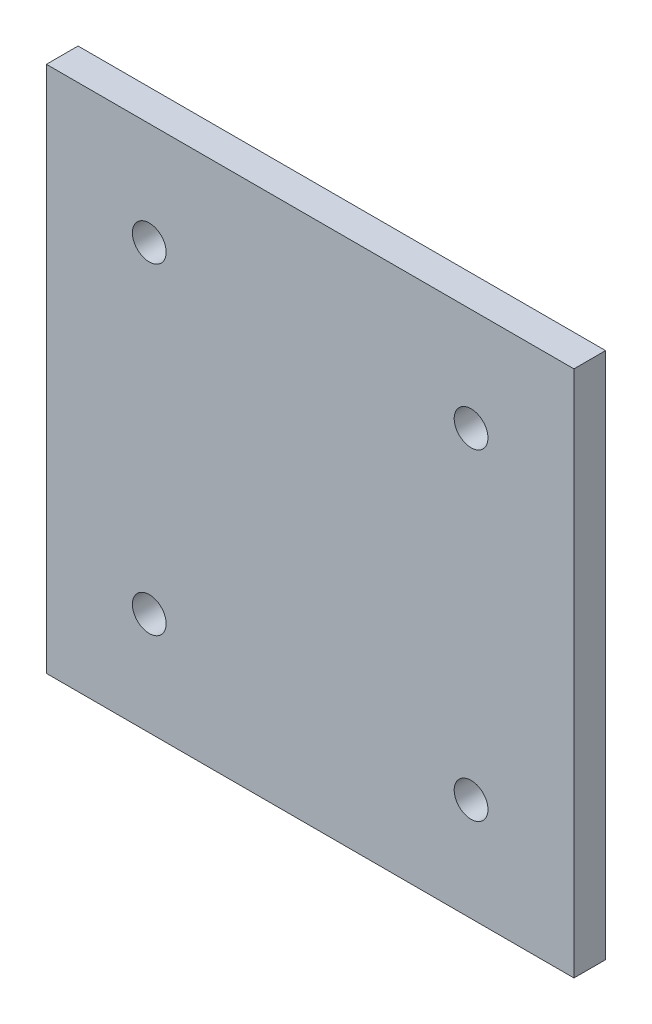
ISO-10303-21;
HEADER;
FILE_DESCRIPTION(('STEP AP214'),'2;1');
FILE_NAME('part.step','',(''),(''),'','','');
FILE_SCHEMA(('AUTOMOTIVE_DESIGN { 1 0 10303 214 1 1 1 1 }'));
ENDSEC;
DATA;
#1=APPLICATION_CONTEXT('core data for automotive mechanical design processes');
#2=APPLICATION_PROTOCOL_DEFINITION('international standard','automotive_design',2000,#1);
#3=PRODUCT_CONTEXT('',#1,'mechanical');
#4=PRODUCT('Part','Part','',(#3));
#5=PRODUCT_RELATED_PRODUCT_CATEGORY('part','',(#4));
#6=PRODUCT_DEFINITION_FORMATION('','',#4);
#7=PRODUCT_DEFINITION_CONTEXT('part definition',#1,'design');
#8=PRODUCT_DEFINITION('design','',#6,#7);
#9=PRODUCT_DEFINITION_SHAPE('','',#8);
#10=(LENGTH_UNIT() NAMED_UNIT(*) SI_UNIT(.MILLI.,.METRE.));
#11=(NAMED_UNIT(*) PLANE_ANGLE_UNIT() SI_UNIT($,.RADIAN.));
#12=(NAMED_UNIT(*) SI_UNIT($,.STERADIAN.) SOLID_ANGLE_UNIT());
#13=UNCERTAINTY_MEASURE_WITH_UNIT(LENGTH_MEASURE(1.E-05),#10,'distance_accuracy_value','');
#14=(GEOMETRIC_REPRESENTATION_CONTEXT(3) GLOBAL_UNCERTAINTY_ASSIGNED_CONTEXT((#13)) GLOBAL_UNIT_ASSIGNED_CONTEXT((#10,
#11,#12)) REPRESENTATION_CONTEXT('',''));
#15=CARTESIAN_POINT('',(0.,0.,0.));
#16=DIRECTION('',(0.,0.,1.));
#17=DIRECTION('',(1.,0.,0.));
#18=AXIS2_PLACEMENT_3D('',#15,#16,#17);
#19=CARTESIAN_POINT('',(0.,0.,3.));
#20=DIRECTION('',(0.,0.,1.));
#21=DIRECTION('',(1.,0.,0.));
#22=AXIS2_PLACEMENT_3D('',#19,#20,#21);
#23=PLANE('',#22);
#24=CARTESIAN_POINT('',(15.25,-15.25,3.));
#25=DIRECTION('',(0.,0.,1.));
#26=DIRECTION('',(1.,0.,0.));
#27=AXIS2_PLACEMENT_3D('',#24,#25,#26);
#28=CIRCLE('',#27,1.6);
#29=CARTESIAN_POINT('',(16.85,-15.25,3.));
#30=VERTEX_POINT('',#29);
#31=EDGE_CURVE('E127',#30,#30,#28,.T.);
#32=ORIENTED_EDGE('',*,*,#31,.F.);
#33=EDGE_LOOP('',(#32));
#34=FACE_BOUND('',#33,.T.);
#35=CARTESIAN_POINT('',(-15.25,-15.25,3.));
#36=DIRECTION('',(0.,0.,1.));
#37=DIRECTION('',(1.,0.,0.));
#38=AXIS2_PLACEMENT_3D('',#35,#36,#37);
#39=CIRCLE('',#38,1.6);
#40=CARTESIAN_POINT('',(-13.65,-15.25,3.));
#41=VERTEX_POINT('',#40);
#42=EDGE_CURVE('E106',#41,#41,#39,.T.);
#43=ORIENTED_EDGE('',*,*,#42,.F.);
#44=EDGE_LOOP('',(#43));
#45=FACE_BOUND('',#44,.T.);
#46=DIRECTION('',(0.,-1.,0.));
#47=VECTOR('',#46,1.);
#48=CARTESIAN_POINT('',(-25.,25.,3.));
#49=LINE('',#48,#47);
#50=CARTESIAN_POINT('',(-25.,25.,3.));
#51=VERTEX_POINT('',#50);
#52=CARTESIAN_POINT('',(-25.,-25.,3.));
#53=VERTEX_POINT('',#52);
#54=EDGE_CURVE('E91',#51,#53,#49,.T.);
#55=ORIENTED_EDGE('',*,*,#54,.T.);
#56=DIRECTION('',(1.,0.,0.));
#57=VECTOR('',#56,1.);
#58=CARTESIAN_POINT('',(-25.,-25.,3.));
#59=LINE('',#58,#57);
#60=CARTESIAN_POINT('',(25.,-25.,3.));
#61=VERTEX_POINT('',#60);
#62=EDGE_CURVE('E86',#53,#61,#59,.T.);
#63=ORIENTED_EDGE('',*,*,#62,.T.);
#64=DIRECTION('',(0.,1.,0.));
#65=VECTOR('',#64,1.);
#66=CARTESIAN_POINT('',(25.,-25.,3.));
#67=LINE('',#66,#65);
#68=CARTESIAN_POINT('',(25.,25.,3.));
#69=VERTEX_POINT('',#68);
#70=EDGE_CURVE('E89',#61,#69,#67,.T.);
#71=ORIENTED_EDGE('',*,*,#70,.T.);
#72=DIRECTION('',(-1.,0.,0.));
#73=VECTOR('',#72,1.);
#74=CARTESIAN_POINT('',(25.,25.,3.));
#75=LINE('',#74,#73);
#76=EDGE_CURVE('E56',#69,#51,#75,.T.);
#77=ORIENTED_EDGE('',*,*,#76,.T.);
#78=EDGE_LOOP('',(#55,#63,#71,#77));
#79=FACE_BOUND('',#78,.T.);
#80=CARTESIAN_POINT('',(-15.25,15.25,3.));
#81=DIRECTION('',(0.,0.,1.));
#82=DIRECTION('',(1.,0.,0.));
#83=AXIS2_PLACEMENT_3D('',#80,#81,#82);
#84=CIRCLE('',#83,1.6);
#85=CARTESIAN_POINT('',(-13.65,15.25,3.));
#86=VERTEX_POINT('',#85);
#87=EDGE_CURVE('E121',#86,#86,#84,.T.);
#88=ORIENTED_EDGE('',*,*,#87,.F.);
#89=EDGE_LOOP('',(#88));
#90=FACE_BOUND('',#89,.T.);
#91=CARTESIAN_POINT('',(15.25,15.25,3.));
#92=DIRECTION('',(0.,0.,1.));
#93=DIRECTION('',(1.,0.,0.));
#94=AXIS2_PLACEMENT_3D('',#91,#92,#93);
#95=CIRCLE('',#94,1.6);
#96=CARTESIAN_POINT('',(16.85,15.25,3.));
#97=VERTEX_POINT('',#96);
#98=EDGE_CURVE('E133',#97,#97,#95,.T.);
#99=ORIENTED_EDGE('',*,*,#98,.F.);
#100=EDGE_LOOP('',(#99));
#101=FACE_BOUND('',#100,.T.);
#102=ADVANCED_FACE('F39',(#34,#45,#79,#90,#101),#23,.T.);
#103=CARTESIAN_POINT('',(0.,0.,0.));
#104=DIRECTION('',(0.,0.,1.));
#105=DIRECTION('',(1.,0.,0.));
#106=AXIS2_PLACEMENT_3D('',#103,#104,#105);
#107=PLANE('',#106);
#108=DIRECTION('',(0.,-1.,0.));
#109=VECTOR('',#108,1.);
#110=CARTESIAN_POINT('',(-25.,25.,0.));
#111=LINE('',#110,#109);
#112=CARTESIAN_POINT('',(-25.,25.,0.));
#113=VERTEX_POINT('',#112);
#114=CARTESIAN_POINT('',(-25.,-25.,0.));
#115=VERTEX_POINT('',#114);
#116=EDGE_CURVE('E103',#113,#115,#111,.T.);
#117=ORIENTED_EDGE('',*,*,#116,.F.);
#118=DIRECTION('',(-1.,0.,0.));
#119=VECTOR('',#118,1.);
#120=CARTESIAN_POINT('',(25.,25.,0.));
#121=LINE('',#120,#119);
#122=CARTESIAN_POINT('',(25.,25.,0.));
#123=VERTEX_POINT('',#122);
#124=EDGE_CURVE('E79',#123,#113,#121,.T.);
#125=ORIENTED_EDGE('',*,*,#124,.F.);
#126=DIRECTION('',(0.,1.,0.));
#127=VECTOR('',#126,1.);
#128=CARTESIAN_POINT('',(25.,-25.,0.));
#129=LINE('',#128,#127);
#130=CARTESIAN_POINT('',(25.,-25.,0.));
#131=VERTEX_POINT('',#130);
#132=EDGE_CURVE('E73',#131,#123,#129,.T.);
#133=ORIENTED_EDGE('',*,*,#132,.F.);
#134=DIRECTION('',(1.,0.,0.));
#135=VECTOR('',#134,1.);
#136=CARTESIAN_POINT('',(-25.,-25.,0.));
#137=LINE('',#136,#135);
#138=EDGE_CURVE('E95',#115,#131,#137,.T.);
#139=ORIENTED_EDGE('',*,*,#138,.F.);
#140=EDGE_LOOP('',(#117,#125,#133,#139));
#141=FACE_BOUND('',#140,.T.);
#142=CARTESIAN_POINT('',(-15.25,-15.25,0.));
#143=DIRECTION('',(0.,0.,1.));
#144=DIRECTION('',(1.,0.,0.));
#145=AXIS2_PLACEMENT_3D('',#142,#143,#144);
#146=CIRCLE('',#145,1.6);
#147=CARTESIAN_POINT('',(-13.65,-15.25,0.));
#148=VERTEX_POINT('',#147);
#149=EDGE_CURVE('E118',#148,#148,#146,.T.);
#150=ORIENTED_EDGE('',*,*,#149,.T.);
#151=EDGE_LOOP('',(#150));
#152=FACE_BOUND('',#151,.T.);
#153=CARTESIAN_POINT('',(-15.25,15.25,0.));
#154=DIRECTION('',(0.,0.,1.));
#155=DIRECTION('',(1.,0.,0.));
#156=AXIS2_PLACEMENT_3D('',#153,#154,#155);
#157=CIRCLE('',#156,1.6);
#158=CARTESIAN_POINT('',(-13.65,15.25,0.));
#159=VERTEX_POINT('',#158);
#160=EDGE_CURVE('E124',#159,#159,#157,.T.);
#161=ORIENTED_EDGE('',*,*,#160,.T.);
#162=EDGE_LOOP('',(#161));
#163=FACE_BOUND('',#162,.T.);
#164=CARTESIAN_POINT('',(15.25,-15.25,0.));
#165=DIRECTION('',(0.,0.,1.));
#166=DIRECTION('',(1.,0.,0.));
#167=AXIS2_PLACEMENT_3D('',#164,#165,#166);
#168=CIRCLE('',#167,1.6);
#169=CARTESIAN_POINT('',(16.85,-15.25,0.));
#170=VERTEX_POINT('',#169);
#171=EDGE_CURVE('E130',#170,#170,#168,.T.);
#172=ORIENTED_EDGE('',*,*,#171,.T.);
#173=EDGE_LOOP('',(#172));
#174=FACE_BOUND('',#173,.T.);
#175=CARTESIAN_POINT('',(15.25,15.25,0.));
#176=DIRECTION('',(0.,0.,1.));
#177=DIRECTION('',(1.,0.,0.));
#178=AXIS2_PLACEMENT_3D('',#175,#176,#177);
#179=CIRCLE('',#178,1.6);
#180=CARTESIAN_POINT('',(16.85,15.25,0.));
#181=VERTEX_POINT('',#180);
#182=EDGE_CURVE('E136',#181,#181,#179,.T.);
#183=ORIENTED_EDGE('',*,*,#182,.T.);
#184=EDGE_LOOP('',(#183));
#185=FACE_BOUND('',#184,.T.);
#186=ADVANCED_FACE('F114',(#141,#152,#163,#174,#185),#107,.F.);
#187=CARTESIAN_POINT('',(-25.,25.,3.));
#188=DIRECTION('',(1.,0.,0.));
#189=DIRECTION('',(0.,0.,-1.));
#190=AXIS2_PLACEMENT_3D('',#187,#188,#189);
#191=PLANE('',#190);
#192=ORIENTED_EDGE('',*,*,#116,.T.);
#193=DIRECTION('',(0.,0.,-1.));
#194=VECTOR('',#193,1.);
#195=CARTESIAN_POINT('',(-25.,-25.,3.));
#196=LINE('',#195,#194);
#197=EDGE_CURVE('E11',#53,#115,#196,.T.);
#198=ORIENTED_EDGE('',*,*,#197,.F.);
#199=ORIENTED_EDGE('',*,*,#54,.F.);
#200=DIRECTION('',(0.,0.,-1.));
#201=VECTOR('',#200,1.);
#202=CARTESIAN_POINT('',(-25.,25.,3.));
#203=LINE('',#202,#201);
#204=EDGE_CURVE('E99',#51,#113,#203,.T.);
#205=ORIENTED_EDGE('',*,*,#204,.T.);
#206=EDGE_LOOP('',(#192,#198,#199,#205));
#207=FACE_BOUND('',#206,.T.);
#208=ADVANCED_FACE('F41',(#207),#191,.F.);
#209=CARTESIAN_POINT('',(-25.,-25.,3.));
#210=DIRECTION('',(0.,1.,0.));
#211=DIRECTION('',(0.,0.,1.));
#212=AXIS2_PLACEMENT_3D('',#209,#210,#211);
#213=PLANE('',#212);
#214=ORIENTED_EDGE('',*,*,#138,.T.);
#215=DIRECTION('',(0.,0.,-1.));
#216=VECTOR('',#215,1.);
#217=CARTESIAN_POINT('',(25.,-25.,3.));
#218=LINE('',#217,#216);
#219=EDGE_CURVE('E48',#61,#131,#218,.T.);
#220=ORIENTED_EDGE('',*,*,#219,.F.);
#221=ORIENTED_EDGE('',*,*,#62,.F.);
#222=ORIENTED_EDGE('',*,*,#197,.T.);
#223=EDGE_LOOP('',(#214,#220,#221,#222));
#224=FACE_BOUND('',#223,.T.);
#225=ADVANCED_FACE('F94',(#224),#213,.F.);
#226=CARTESIAN_POINT('',(25.,-25.,3.));
#227=DIRECTION('',(-1.,0.,0.));
#228=DIRECTION('',(0.,0.,1.));
#229=AXIS2_PLACEMENT_3D('',#226,#227,#228);
#230=PLANE('',#229);
#231=ORIENTED_EDGE('',*,*,#132,.T.);
#232=DIRECTION('',(0.,0.,-1.));
#233=VECTOR('',#232,1.);
#234=CARTESIAN_POINT('',(25.,25.,3.));
#235=LINE('',#234,#233);
#236=EDGE_CURVE('E96',#69,#123,#235,.T.);
#237=ORIENTED_EDGE('',*,*,#236,.F.);
#238=ORIENTED_EDGE('',*,*,#70,.F.);
#239=ORIENTED_EDGE('',*,*,#219,.T.);
#240=EDGE_LOOP('',(#231,#237,#238,#239));
#241=FACE_BOUND('',#240,.T.);
#242=ADVANCED_FACE('F97',(#241),#230,.F.);
#243=CARTESIAN_POINT('',(25.,25.,3.));
#244=DIRECTION('',(0.,-1.,0.));
#245=DIRECTION('',(0.,0.,-1.));
#246=AXIS2_PLACEMENT_3D('',#243,#244,#245);
#247=PLANE('',#246);
#248=ORIENTED_EDGE('',*,*,#124,.T.);
#249=ORIENTED_EDGE('',*,*,#204,.F.);
#250=ORIENTED_EDGE('',*,*,#76,.F.);
#251=ORIENTED_EDGE('',*,*,#236,.T.);
#252=EDGE_LOOP('',(#248,#249,#250,#251));
#253=FACE_BOUND('',#252,.T.);
#254=ADVANCED_FACE('F111',(#253),#247,.F.);
#255=CARTESIAN_POINT('',(-15.25,-15.25,3.));
#256=DIRECTION('',(0.,0.,-1.));
#257=DIRECTION('',(-1.,0.,0.));
#258=AXIS2_PLACEMENT_3D('',#255,#256,#257);
#259=CYLINDRICAL_SURFACE('',#258,1.6);
#260=ORIENTED_EDGE('',*,*,#42,.T.);
#261=EDGE_LOOP('',(#260));
#262=FACE_BOUND('',#261,.T.);
#263=ORIENTED_EDGE('',*,*,#149,.F.);
#264=EDGE_LOOP('',(#263));
#265=FACE_BOUND('',#264,.T.);
#266=ADVANCED_FACE('F155',(#262,#265),#259,.F.);
#267=CARTESIAN_POINT('',(-15.25,15.25,3.));
#268=DIRECTION('',(0.,0.,-1.));
#269=DIRECTION('',(-1.,0.,0.));
#270=AXIS2_PLACEMENT_3D('',#267,#268,#269);
#271=CYLINDRICAL_SURFACE('',#270,1.6);
#272=ORIENTED_EDGE('',*,*,#87,.T.);
#273=EDGE_LOOP('',(#272));
#274=FACE_BOUND('',#273,.T.);
#275=ORIENTED_EDGE('',*,*,#160,.F.);
#276=EDGE_LOOP('',(#275));
#277=FACE_BOUND('',#276,.T.);
#278=ADVANCED_FACE('F209',(#274,#277),#271,.F.);
#279=CARTESIAN_POINT('',(15.25,-15.25,3.));
#280=DIRECTION('',(0.,0.,-1.));
#281=DIRECTION('',(-1.,0.,0.));
#282=AXIS2_PLACEMENT_3D('',#279,#280,#281);
#283=CYLINDRICAL_SURFACE('',#282,1.6);
#284=ORIENTED_EDGE('',*,*,#31,.T.);
#285=EDGE_LOOP('',(#284));
#286=FACE_BOUND('',#285,.T.);
#287=ORIENTED_EDGE('',*,*,#171,.F.);
#288=EDGE_LOOP('',(#287));
#289=FACE_BOUND('',#288,.T.);
#290=ADVANCED_FACE('F218',(#286,#289),#283,.F.);
#291=CARTESIAN_POINT('',(15.25,15.25,3.));
#292=DIRECTION('',(0.,0.,-1.));
#293=DIRECTION('',(-1.,0.,0.));
#294=AXIS2_PLACEMENT_3D('',#291,#292,#293);
#295=CYLINDRICAL_SURFACE('',#294,1.6);
#296=ORIENTED_EDGE('',*,*,#98,.T.);
#297=EDGE_LOOP('',(#296));
#298=FACE_BOUND('',#297,.T.);
#299=ORIENTED_EDGE('',*,*,#182,.F.);
#300=EDGE_LOOP('',(#299));
#301=FACE_BOUND('',#300,.T.);
#302=ADVANCED_FACE('F142',(#298,#301),#295,.F.);
#303=CLOSED_SHELL('',(#102,#186,#208,#225,#242,#254,#266,#278,#290,#302));
#304=MANIFOLD_SOLID_BREP('B2',#303);
#305=ADVANCED_BREP_SHAPE_REPRESENTATION('',(#18,#304),#14);
#306=SHAPE_DEFINITION_REPRESENTATION(#9,#305);
ENDSEC;
END-ISO-10303-21;
